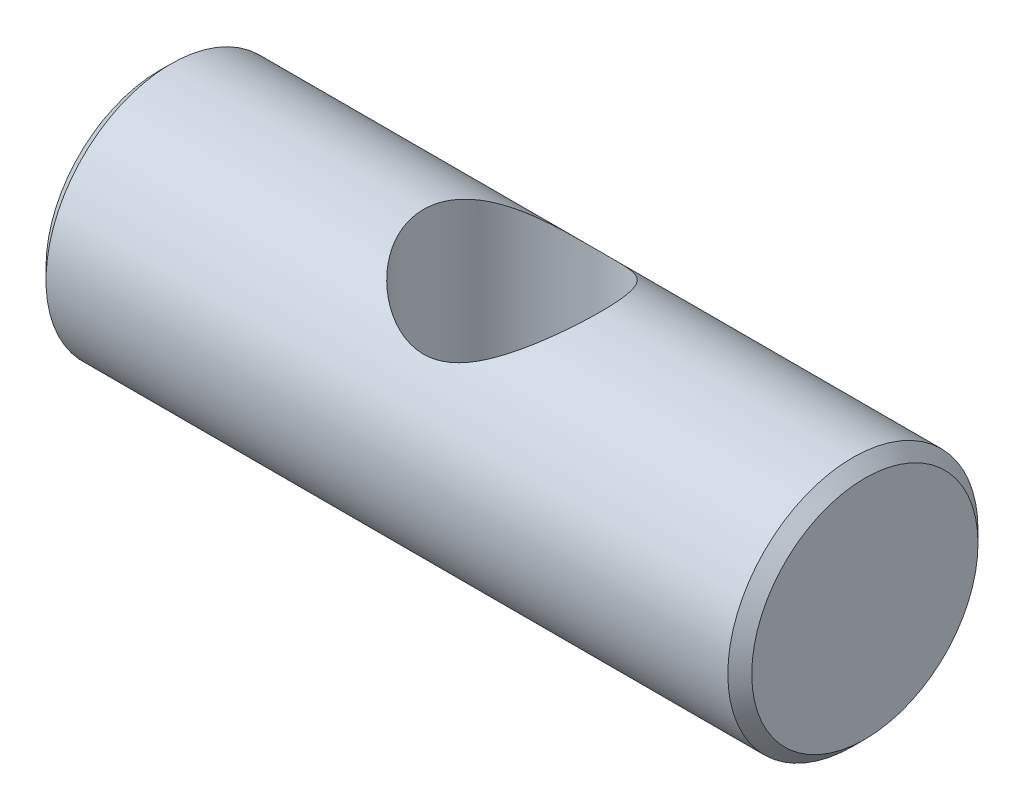
ISO-10303-21;
HEADER;
FILE_DESCRIPTION(('STEP AP214'),'2;1');
FILE_NAME('part.step','',(''),(''),'','','');
FILE_SCHEMA(('AUTOMOTIVE_DESIGN { 1 0 10303 214 1 1 1 1 }'));
ENDSEC;
DATA;
#1=APPLICATION_CONTEXT('core data for automotive mechanical design processes');
#2=APPLICATION_PROTOCOL_DEFINITION('international standard','automotive_design',2000,#1);
#3=PRODUCT_CONTEXT('',#1,'mechanical');
#4=PRODUCT('Part','Part','',(#3));
#5=PRODUCT_RELATED_PRODUCT_CATEGORY('part','',(#4));
#6=PRODUCT_DEFINITION_FORMATION('','',#4);
#7=PRODUCT_DEFINITION_CONTEXT('part definition',#1,'design');
#8=PRODUCT_DEFINITION('design','',#6,#7);
#9=PRODUCT_DEFINITION_SHAPE('','',#8);
#10=(LENGTH_UNIT() NAMED_UNIT(*) SI_UNIT(.MILLI.,.METRE.));
#11=(NAMED_UNIT(*) PLANE_ANGLE_UNIT() SI_UNIT($,.RADIAN.));
#12=(NAMED_UNIT(*) SI_UNIT($,.STERADIAN.) SOLID_ANGLE_UNIT());
#13=UNCERTAINTY_MEASURE_WITH_UNIT(LENGTH_MEASURE(1.E-05),#10,'distance_accuracy_value','');
#14=(GEOMETRIC_REPRESENTATION_CONTEXT(3) GLOBAL_UNCERTAINTY_ASSIGNED_CONTEXT((#13)) GLOBAL_UNIT_ASSIGNED_CONTEXT((#10,
#11,#12)) REPRESENTATION_CONTEXT('',''));
#15=CARTESIAN_POINT('',(0.,0.,0.));
#16=DIRECTION('',(0.,0.,1.));
#17=DIRECTION('',(1.,0.,0.));
#18=AXIS2_PLACEMENT_3D('',#15,#16,#17);
#19=CARTESIAN_POINT('',(0.,-3.2512,0.));
#20=DIRECTION('',(0.,1.,0.));
#21=DIRECTION('',(0.,0.,1.));
#22=AXIS2_PLACEMENT_3D('',#19,#20,#21);
#23=CYLINDRICAL_SURFACE('',#22,2.2479);
#24=CARTESIAN_POINT('',(0.,2.24042578607282,2.2479));
#25=CARTESIAN_POINT('',(-0.0537109222047659,2.24042480681561,2.24790052674043));
#26=CARTESIAN_POINT('',(-0.107415910724846,2.24236790219379,2.24596984430389));
#27=CARTESIAN_POINT('',(-0.21429267848827,2.25001756988373,2.23830503892118));
#28=CARTESIAN_POINT('',(-0.267464218879364,2.25572575780816,2.23256928320038));
#29=CARTESIAN_POINT('',(-0.425621878794791,2.27811595301241,2.20980208374806));
#30=CARTESIAN_POINT('',(-0.529122154814027,2.30006251636457,2.18721115424107));
#31=CARTESIAN_POINT('',(-0.728114975075887,2.35382585101758,2.12921938163096));
#32=CARTESIAN_POINT('',(-0.823686304353623,2.38552550345795,2.09396975110969));
#33=CARTESIAN_POINT('',(-1.00734597553308,2.4550023626235,2.01206707649596));
#34=CARTESIAN_POINT('',(-1.09543401923457,2.49277981136839,1.96541357825958));
#35=CARTESIAN_POINT('',(-1.27898495269226,2.57828612332488,1.85226546109516));
#36=CARTESIAN_POINT('',(-1.37291274116306,2.62658097137406,1.78370995440357));
#37=CARTESIAN_POINT('',(-1.54930843985851,2.72294307114867,1.63284401415508));
#38=CARTESIAN_POINT('',(-1.63176173401299,2.77100995860822,1.55051632629234));
#39=CARTESIAN_POINT('',(-1.79703046761159,2.87120033747202,1.35740517350871));
#40=CARTESIAN_POINT('',(-1.87745895021036,2.9225951196008,1.24416285969268));
#41=CARTESIAN_POINT('',(-2.01733938295148,3.01436410429773,1.00144708177631));
#42=CARTESIAN_POINT('',(-2.0768342764481,3.05476082938206,0.872007593447904));
#43=CARTESIAN_POINT('',(-2.15799855995829,3.11060546098944,0.637941095013784));
#44=CARTESIAN_POINT('',(-2.18556755715773,3.12985762579621,0.536251541304838));
#45=CARTESIAN_POINT('',(-2.22624802432013,3.15839710398021,0.328676755748413));
#46=CARTESIAN_POINT('',(-2.23937126186062,3.16769252799459,0.222795011832668));
#47=CARTESIAN_POINT('',(-2.25041726781011,3.17551106747307,0.00961981493627157));
#48=CARTESIAN_POINT('',(-2.24830896045661,3.17401216010376,-0.0976760780763765));
#49=CARTESIAN_POINT('',(-2.22895033394951,3.16032928964492,-0.310204852932953));
#50=CARTESIAN_POINT('',(-2.21169582012088,3.14814236655746,-0.415437155020055));
#51=CARTESIAN_POINT('',(-2.16363237049291,3.11456689332342,-0.618355387693775));
#52=CARTESIAN_POINT('',(-2.13316786385447,3.09341245158065,-0.71616336671814));
#53=CARTESIAN_POINT('',(-2.06014747187272,3.04351872913014,-0.905047335043489));
#54=CARTESIAN_POINT('',(-2.01758929552188,3.01477801136253,-0.996122044680085));
#55=CARTESIAN_POINT('',(-1.91645840280552,2.94800193382969,-1.18002386545818));
#56=CARTESIAN_POINT('',(-1.85662685545849,2.90928651565154,-1.2719075266416));
#57=CARTESIAN_POINT('',(-1.72545335615151,2.82737884446098,-1.44487716024602));
#58=CARTESIAN_POINT('',(-1.65409926674496,2.78418188809731,-1.52595158035719));
#59=CARTESIAN_POINT('',(-1.48718277532833,2.68807028145804,-1.69040534222362));
#60=CARTESIAN_POINT('',(-1.38957794640485,2.63481770717866,-1.77151939409626));
#61=CARTESIAN_POINT('',(-1.18108333038507,2.53106365150156,-1.91682959161943));
#62=CARTESIAN_POINT('',(-1.07019394403743,2.48056208718231,-1.98102624742182));
#63=CARTESIAN_POINT('',(-0.86263953317336,2.39932155828788,-2.07819063146827));
#64=CARTESIAN_POINT('',(-0.768488887790755,2.36670137202755,-2.11494098027586));
#65=CARTESIAN_POINT('',(-0.57366469286713,2.31084141504793,-2.17584470486237));
#66=CARTESIAN_POINT('',(-0.473011978674849,2.28757325388182,-2.20003627223663));
#67=CARTESIAN_POINT('',(-0.309548206638323,2.26091305743354,-2.22733632967836));
#68=CARTESIAN_POINT('',(-0.248160259876556,2.25328286367124,-2.2350227892514));
#69=CARTESIAN_POINT('',(-0.124512264812123,2.24303959423893,-2.24530452337338));
#70=CARTESIAN_POINT('',(-0.0622521469509865,2.24042692105359,-2.2478993894962));
#71=CARTESIAN_POINT('',(0.0537109222047628,2.24042480681561,-2.24790052674043));
#72=CARTESIAN_POINT('',(0.107415910724843,2.24236790219379,-2.24596984430389));
#73=CARTESIAN_POINT('',(0.214292678488267,2.25001756988373,-2.23830503892118));
#74=CARTESIAN_POINT('',(0.267464218879361,2.25572575780816,-2.23256928320039));
#75=CARTESIAN_POINT('',(0.425621878794788,2.27811595301241,-2.20980208374806));
#76=CARTESIAN_POINT('',(0.529122154814024,2.30006251636457,-2.18721115424107));
#77=CARTESIAN_POINT('',(0.728114975075883,2.35382585101758,-2.12921938163096));
#78=CARTESIAN_POINT('',(0.823686304353619,2.38552550345795,-2.09396975110969));
#79=CARTESIAN_POINT('',(1.00734597553308,2.4550023626235,-2.01206707649596));
#80=CARTESIAN_POINT('',(1.09543401923457,2.49277981136838,-1.96541357825958));
#81=CARTESIAN_POINT('',(1.27898495269226,2.57828612332488,-1.85226546109516));
#82=CARTESIAN_POINT('',(1.37291274116306,2.62658097137406,-1.78370995440357));
#83=CARTESIAN_POINT('',(1.54930843985851,2.72294307114867,-1.63284401415508));
#84=CARTESIAN_POINT('',(1.63176173401299,2.77100995860821,-1.55051632629235));
#85=CARTESIAN_POINT('',(1.79703046761159,2.87120033747202,-1.35740517350871));
#86=CARTESIAN_POINT('',(1.87745895021036,2.92259511960079,-1.24416285969268));
#87=CARTESIAN_POINT('',(2.01733938295148,3.01436410429773,-1.00144708177632));
#88=CARTESIAN_POINT('',(2.0768342764481,3.05476082938206,-0.872007593447909));
#89=CARTESIAN_POINT('',(2.15799855995829,3.11060546098944,-0.637941095013788));
#90=CARTESIAN_POINT('',(2.18556755715773,3.1298576257962,-0.536251541304843));
#91=CARTESIAN_POINT('',(2.22624802432013,3.15839710398021,-0.328676755748417));
#92=CARTESIAN_POINT('',(2.23937126186062,3.16769252799459,-0.222795011832672));
#93=CARTESIAN_POINT('',(2.25041726781011,3.17551106747307,-0.00961981493627542));
#94=CARTESIAN_POINT('',(2.24830896045661,3.17401216010376,0.0976760780763729));
#95=CARTESIAN_POINT('',(2.22895033394951,3.16032928964492,0.31020485293295));
#96=CARTESIAN_POINT('',(2.21169582012088,3.14814236655746,0.415437155020052));
#97=CARTESIAN_POINT('',(2.16363237049291,3.11456689332342,0.618355387693773));
#98=CARTESIAN_POINT('',(2.13316786385447,3.09341245158065,0.716163366718138));
#99=CARTESIAN_POINT('',(2.06014747187272,3.04351872913014,0.905047335043487));
#100=CARTESIAN_POINT('',(2.01758929552188,3.01477801136253,0.996122044680082));
#101=CARTESIAN_POINT('',(1.91645840280552,2.9480019338297,1.18002386545818));
#102=CARTESIAN_POINT('',(1.85662685545849,2.90928651565155,1.27190752664159));
#103=CARTESIAN_POINT('',(1.72545335615151,2.82737884446098,1.44487716024601));
#104=CARTESIAN_POINT('',(1.65409926674496,2.78418188809731,1.52595158035719));
#105=CARTESIAN_POINT('',(1.48718277532834,2.68807028145804,1.69040534222362));
#106=CARTESIAN_POINT('',(1.38957794640485,2.63481770717866,1.77151939409625));
#107=CARTESIAN_POINT('',(1.18108333038508,2.53106365150156,1.91682959161943));
#108=CARTESIAN_POINT('',(1.07019394403743,2.48056208718231,1.98102624742182));
#109=CARTESIAN_POINT('',(0.862639533173363,2.39932155828788,2.07819063146827));
#110=CARTESIAN_POINT('',(0.768488887790758,2.36670137202755,2.11494098027586));
#111=CARTESIAN_POINT('',(0.573664692867132,2.31084141504793,2.17584470486237));
#112=CARTESIAN_POINT('',(0.473011978674852,2.28757325388182,2.20003627223663));
#113=CARTESIAN_POINT('',(0.309548206638325,2.26091305743354,2.22733632967836));
#114=CARTESIAN_POINT('',(0.248160259876557,2.25328286367124,2.2350227892514));
#115=CARTESIAN_POINT('',(0.124512264812122,2.24303959423893,2.24530452337338));
#116=CARTESIAN_POINT('',(0.0622521469509844,2.24042692105359,2.2478993894962));
#117=CARTESIAN_POINT('',(0.,2.24042578607282,2.2479));
#118=B_SPLINE_CURVE_WITH_KNOTS('',3,(#24,#25,#26,#27,#28,#29,#30,#31,#32,#33,#34,#35,#36,#37,
#38,#39,#40,#41,#42,#43,#44,#45,#46,#47,#48,#49,#50,#51,#52,#53,#54,#55,#56,#57,#58,#59,#60,#61,
#62,#63,#64,#65,#66,#67,#68,#69,#70,#71,#72,#73,#74,#75,#76,#77,#78,#79,#80,#81,#82,#83,#84,#85,
#86,#87,#88,#89,#90,#91,#92,#93,#94,#95,#96,#97,#98,#99,#100,#101,#102,#103,#104,#105,#106,#107,
#108,#109,#110,#111,#112,#113,#114,#115,#116,#117),.UNSPECIFIED.,.T.,.F.,(4,2,2,2,2,2,2,2,2,2,2,
2,2,2,2,2,2,2,2,2,2,2,2,2,2,2,2,2,2,2,2,2,2,2,2,2,2,2,2,2,2,2,2,2,2,2,4),(0.,0.161049247055113,
0.322167645829137,0.64478438526156,0.963668987437373,1.28256629083955,1.65897662189148,
2.03586211505108,2.47770566111403,2.91863744704056,3.23857938672654,3.55826050702774,
3.87859403232042,4.19901630056844,4.5115439763463,4.82413089643475,5.17168188843986,
5.51960139576506,5.93083300076942,6.34205220347626,6.65959200600966,6.97616041975302,
7.16280508835439,7.34946472819077,7.51051397524588,7.67163237401991,7.99424911345233,
8.31313371562814,8.63203101903032,9.00844135008225,9.38532684324185,9.8271703893048,
10.2681021752313,10.5880441149173,10.9077252352185,11.2280587605112,11.5484810287592,
11.8610087045371,12.1735956246255,12.5211466166306,12.8690661239558,13.2802977289602,
13.691516931667,14.0090567342004,14.3256251479438,14.5122698165452,14.6989294563816),.UNSPECIFIED.);
#119=CARTESIAN_POINT('',(0.,2.24042578607282,2.2479));
#120=VERTEX_POINT('',#119);
#121=EDGE_CURVE('E28',#120,#120,#118,.T.);
#122=ORIENTED_EDGE('',*,*,#121,.F.);
#123=EDGE_LOOP('',(#122));
#124=FACE_BOUND('',#123,.T.);
#125=CARTESIAN_POINT('',(0.,-2.24042578607282,-2.2479));
#126=CARTESIAN_POINT('',(-0.0537109222047621,-2.24042480681561,-2.24790052674043));
#127=CARTESIAN_POINT('',(-0.107415910724842,-2.24236790219379,-2.24596984430389));
#128=CARTESIAN_POINT('',(-0.214292678488266,-2.25001756988373,-2.23830503892118));
#129=CARTESIAN_POINT('',(-0.26746421887936,-2.25572575780816,-2.23256928320039));
#130=CARTESIAN_POINT('',(-0.425621878794787,-2.27811595301241,-2.20980208374806));
#131=CARTESIAN_POINT('',(-0.529122154814023,-2.30006251636457,-2.18721115424107));
#132=CARTESIAN_POINT('',(-0.728114975075883,-2.35382585101758,-2.12921938163096));
#133=CARTESIAN_POINT('',(-0.823686304353619,-2.38552550345795,-2.09396975110969));
#134=CARTESIAN_POINT('',(-1.00734597553308,-2.4550023626235,-2.01206707649597));
#135=CARTESIAN_POINT('',(-1.09543401923457,-2.49277981136838,-1.96541357825958));
#136=CARTESIAN_POINT('',(-1.27898495269226,-2.57828612332488,-1.85226546109516));
#137=CARTESIAN_POINT('',(-1.37291274116306,-2.62658097137406,-1.78370995440357));
#138=CARTESIAN_POINT('',(-1.54930843985851,-2.72294307114867,-1.63284401415508));
#139=CARTESIAN_POINT('',(-1.63176173401298,-2.77100995860821,-1.55051632629235));
#140=CARTESIAN_POINT('',(-1.79703046761159,-2.87120033747202,-1.35740517350872));
#141=CARTESIAN_POINT('',(-1.87745895021036,-2.92259511960079,-1.24416285969269));
#142=CARTESIAN_POINT('',(-2.01733938295148,-3.01436410429773,-1.00144708177632));
#143=CARTESIAN_POINT('',(-2.0768342764481,-3.05476082938206,-0.87200759344791));
#144=CARTESIAN_POINT('',(-2.15799855995829,-3.11060546098944,-0.637941095013789));
#145=CARTESIAN_POINT('',(-2.18556755715773,-3.1298576257962,-0.536251541304844));
#146=CARTESIAN_POINT('',(-2.22624802432013,-3.15839710398021,-0.328676755748418));
#147=CARTESIAN_POINT('',(-2.23937126186062,-3.16769252799459,-0.222795011832673));
#148=CARTESIAN_POINT('',(-2.25041726781011,-3.17551106747307,-0.00961981493627659));
#149=CARTESIAN_POINT('',(-2.24830896045661,-3.17401216010376,0.0976760780763717));
#150=CARTESIAN_POINT('',(-2.22895033394951,-3.16032928964492,0.310204852932949));
#151=CARTESIAN_POINT('',(-2.21169582012088,-3.14814236655746,0.41543715502005));
#152=CARTESIAN_POINT('',(-2.16363237049291,-3.11456689332342,0.618355387693771));
#153=CARTESIAN_POINT('',(-2.13316786385447,-3.09341245158066,0.716163366718136));
#154=CARTESIAN_POINT('',(-2.06014747187272,-3.04351872913014,0.905047335043485));
#155=CARTESIAN_POINT('',(-2.01758929552188,-3.01477801136254,0.996122044680081));
#156=CARTESIAN_POINT('',(-1.91645840280552,-2.9480019338297,1.18002386545818));
#157=CARTESIAN_POINT('',(-1.85662685545849,-2.90928651565155,1.27190752664159));
#158=CARTESIAN_POINT('',(-1.72545335615152,-2.82737884446099,1.44487716024601));
#159=CARTESIAN_POINT('',(-1.65409926674496,-2.78418188809731,1.52595158035719));
#160=CARTESIAN_POINT('',(-1.48718277532834,-2.68807028145804,1.69040534222361));
#161=CARTESIAN_POINT('',(-1.38957794640485,-2.63481770717866,1.77151939409625));
#162=CARTESIAN_POINT('',(-1.18108333038508,-2.53106365150156,1.91682959161943));
#163=CARTESIAN_POINT('',(-1.07019394403743,-2.48056208718231,1.98102624742182));
#164=CARTESIAN_POINT('',(-0.862639533173365,-2.39932155828788,2.07819063146827));
#165=CARTESIAN_POINT('',(-0.76848888779076,-2.36670137202755,2.11494098027585));
#166=CARTESIAN_POINT('',(-0.573664692867134,-2.31084141504793,2.17584470486237));
#167=CARTESIAN_POINT('',(-0.473011978674854,-2.28757325388182,2.20003627223663));
#168=CARTESIAN_POINT('',(-0.309548206638326,-2.26091305743354,2.22733632967836));
#169=CARTESIAN_POINT('',(-0.248160259876558,-2.25328286367124,2.2350227892514));
#170=CARTESIAN_POINT('',(-0.124512264812122,-2.24303959423893,2.24530452337338));
#171=CARTESIAN_POINT('',(-0.0622521469509845,-2.24042692105359,2.2478993894962));
#172=CARTESIAN_POINT('',(0.0537109222047657,-2.24042480681561,2.24790052674043));
#173=CARTESIAN_POINT('',(0.107415910724845,-2.24236790219379,2.24596984430389));
#174=CARTESIAN_POINT('',(0.21429267848827,-2.25001756988373,2.23830503892118));
#175=CARTESIAN_POINT('',(0.267464218879363,-2.25572575780816,2.23256928320039));
#176=CARTESIAN_POINT('',(0.425621878794791,-2.27811595301241,2.20980208374806));
#177=CARTESIAN_POINT('',(0.529122154814027,-2.30006251636457,2.18721115424107));
#178=CARTESIAN_POINT('',(0.728114975075886,-2.35382585101758,2.12921938163096));
#179=CARTESIAN_POINT('',(0.823686304353622,-2.38552550345795,2.09396975110969));
#180=CARTESIAN_POINT('',(1.00734597553308,-2.4550023626235,2.01206707649596));
#181=CARTESIAN_POINT('',(1.09543401923457,-2.49277981136839,1.96541357825958));
#182=CARTESIAN_POINT('',(1.27898495269226,-2.57828612332488,1.85226546109516));
#183=CARTESIAN_POINT('',(1.37291274116306,-2.62658097137406,1.78370995440357));
#184=CARTESIAN_POINT('',(1.54930843985851,-2.72294307114867,1.63284401415508));
#185=CARTESIAN_POINT('',(1.63176173401299,-2.77100995860822,1.55051632629234));
#186=CARTESIAN_POINT('',(1.79703046761159,-2.87120033747202,1.35740517350871));
#187=CARTESIAN_POINT('',(1.87745895021036,-2.9225951196008,1.24416285969268));
#188=CARTESIAN_POINT('',(2.01733938295148,-3.01436410429773,1.00144708177631));
#189=CARTESIAN_POINT('',(2.0768342764481,-3.05476082938206,0.872007593447904));
#190=CARTESIAN_POINT('',(2.15799855995829,-3.11060546098944,0.637941095013784));
#191=CARTESIAN_POINT('',(2.18556755715773,-3.12985762579621,0.536251541304839));
#192=CARTESIAN_POINT('',(2.22624802432013,-3.15839710398021,0.328676755748413));
#193=CARTESIAN_POINT('',(2.23937126186062,-3.16769252799459,0.222795011832668));
#194=CARTESIAN_POINT('',(2.25041726781011,-3.17551106747307,0.0096198149362719));
#195=CARTESIAN_POINT('',(2.24830896045661,-3.17401216010376,-0.0976760780763758));
#196=CARTESIAN_POINT('',(2.22895033394951,-3.16032928964492,-0.310204852932952));
#197=CARTESIAN_POINT('',(2.21169582012088,-3.14814236655746,-0.415437155020054));
#198=CARTESIAN_POINT('',(2.16363237049291,-3.11456689332342,-0.618355387693775));
#199=CARTESIAN_POINT('',(2.13316786385447,-3.09341245158065,-0.71616336671814));
#200=CARTESIAN_POINT('',(2.06014747187272,-3.04351872913014,-0.905047335043489));
#201=CARTESIAN_POINT('',(2.01758929552188,-3.01477801136253,-0.996122044680085));
#202=CARTESIAN_POINT('',(1.91645840280552,-2.94800193382969,-1.18002386545818));
#203=CARTESIAN_POINT('',(1.85662685545849,-2.90928651565154,-1.2719075266416));
#204=CARTESIAN_POINT('',(1.72545335615151,-2.82737884446098,-1.44487716024602));
#205=CARTESIAN_POINT('',(1.65409926674496,-2.78418188809731,-1.52595158035719));
#206=CARTESIAN_POINT('',(1.48718277532833,-2.68807028145804,-1.69040534222362));
#207=CARTESIAN_POINT('',(1.38957794640485,-2.63481770717866,-1.77151939409626));
#208=CARTESIAN_POINT('',(1.18108333038507,-2.53106365150156,-1.91682959161943));
#209=CARTESIAN_POINT('',(1.07019394403743,-2.48056208718231,-1.98102624742182));
#210=CARTESIAN_POINT('',(0.86263953317336,-2.39932155828788,-2.07819063146827));
#211=CARTESIAN_POINT('',(0.768488887790755,-2.36670137202755,-2.11494098027586));
#212=CARTESIAN_POINT('',(0.573664692867129,-2.31084141504793,-2.17584470486237));
#213=CARTESIAN_POINT('',(0.473011978674849,-2.28757325388182,-2.20003627223663));
#214=CARTESIAN_POINT('',(0.309548206638323,-2.26091305743354,-2.22733632967836));
#215=CARTESIAN_POINT('',(0.248160259876557,-2.25328286367124,-2.2350227892514));
#216=CARTESIAN_POINT('',(0.124512264812124,-2.24303959423893,-2.24530452337338));
#217=CARTESIAN_POINT('',(0.0622521469509871,-2.24042692105359,-2.2478993894962));
#218=CARTESIAN_POINT('',(0.,-2.24042578607282,-2.2479));
#219=B_SPLINE_CURVE_WITH_KNOTS('',3,(#125,#126,#127,#128,#129,#130,#131,#132,#133,#134,#135,
#136,#137,#138,#139,#140,#141,#142,#143,#144,#145,#146,#147,#148,#149,#150,#151,#152,#153,#154,
#155,#156,#157,#158,#159,#160,#161,#162,#163,#164,#165,#166,#167,#168,#169,#170,#171,#172,#173,
#174,#175,#176,#177,#178,#179,#180,#181,#182,#183,#184,#185,#186,#187,#188,#189,#190,#191,#192,
#193,#194,#195,#196,#197,#198,#199,#200,#201,#202,#203,#204,#205,#206,#207,#208,#209,#210,#211,
#212,#213,#214,#215,#216,#217,#218),.UNSPECIFIED.,.T.,.F.,(4,2,2,2,2,2,2,2,2,2,2,2,2,2,2,2,2,2,
2,2,2,2,2,2,2,2,2,2,2,2,2,2,2,2,2,2,2,2,2,2,2,2,2,2,2,2,4),(0.,0.161049247055113,
0.322167645829136,0.64478438526156,0.963668987437373,1.28256629083955,1.65897662189148,
2.03586211505108,2.47770566111402,2.91863744704056,3.23857938672654,3.55826050702774,
3.87859403232041,4.19901630056844,4.5115439763463,4.82413089643475,5.17168188843986,
5.51960139576505,5.93083300076941,6.34205220347626,6.65959200600965,6.97616041975301,
7.1628050883544,7.34946472819078,7.51051397524589,7.67163237401991,7.99424911345234,
8.31313371562815,8.63203101903033,9.00844135008226,9.38532684324186,9.82717038930481,
10.2681021752313,10.5880441149173,10.9077252352185,11.2280587605112,11.5484810287592,
11.8610087045371,12.1735956246255,12.5211466166306,12.8690661239558,13.2802977289602,
13.691516931667,14.0090567342004,14.3256251479438,14.5122698165452,14.6989294563816),.UNSPECIFIED.);
#220=CARTESIAN_POINT('',(0.,-2.24042578607282,-2.2479));
#221=VERTEX_POINT('',#220);
#222=EDGE_CURVE('E19',#221,#221,#219,.T.);
#223=ORIENTED_EDGE('',*,*,#222,.F.);
#224=EDGE_LOOP('',(#223));
#225=FACE_BOUND('',#224,.T.);
#226=ADVANCED_FACE('F15',(#124,#225),#23,.F.);
#227=CARTESIAN_POINT('',(8.9535,0.,0.));
#228=DIRECTION('',(-1.,0.,0.));
#229=DIRECTION('',(0.,0.,1.));
#230=AXIS2_PLACEMENT_3D('',#227,#228,#229);
#231=CONICAL_SURFACE('',#230,2.8702,0.785398163397446);
#232=CARTESIAN_POINT('',(8.64997,0.,0.));
#233=DIRECTION('',(1.,0.,0.));
#234=DIRECTION('',(0.,0.,1.));
#235=AXIS2_PLACEMENT_3D('',#232,#233,#234);
#236=CIRCLE('',#235,3.17373);
#237=CARTESIAN_POINT('',(8.64997,0.,3.17373));
#238=VERTEX_POINT('',#237);
#239=EDGE_CURVE('E10',#238,#238,#236,.T.);
#240=ORIENTED_EDGE('',*,*,#239,.T.);
#241=EDGE_LOOP('',(#240));
#242=FACE_BOUND('',#241,.T.);
#243=CARTESIAN_POINT('',(8.9535,0.,0.));
#244=DIRECTION('',(1.,0.,0.));
#245=DIRECTION('',(0.,0.,-1.));
#246=AXIS2_PLACEMENT_3D('',#243,#244,#245);
#247=CIRCLE('',#246,2.8702);
#248=CARTESIAN_POINT('',(8.9535,0.,-2.8702));
#249=VERTEX_POINT('',#248);
#250=EDGE_CURVE('E36',#249,#249,#247,.T.);
#251=ORIENTED_EDGE('',*,*,#250,.F.);
#252=EDGE_LOOP('',(#251));
#253=FACE_BOUND('',#252,.T.);
#254=ADVANCED_FACE('F51',(#242,#253),#231,.T.);
#255=CARTESIAN_POINT('',(-8.9535,0.,0.));
#256=DIRECTION('',(1.,0.,0.));
#257=DIRECTION('',(0.,0.,-1.));
#258=AXIS2_PLACEMENT_3D('',#255,#256,#257);
#259=CYLINDRICAL_SURFACE('',#258,3.17373);
#260=ORIENTED_EDGE('',*,*,#239,.F.);
#261=EDGE_LOOP('',(#260));
#262=FACE_BOUND('',#261,.T.);
#263=ORIENTED_EDGE('',*,*,#121,.T.);
#264=EDGE_LOOP('',(#263));
#265=FACE_BOUND('',#264,.T.);
#266=CARTESIAN_POINT('',(-8.64997,0.,0.));
#267=DIRECTION('',(-1.,0.,0.));
#268=DIRECTION('',(0.,0.,-1.));
#269=AXIS2_PLACEMENT_3D('',#266,#267,#268);
#270=CIRCLE('',#269,3.17373);
#271=CARTESIAN_POINT('',(-8.64997,0.,-3.17373));
#272=VERTEX_POINT('',#271);
#273=EDGE_CURVE('E33',#272,#272,#270,.T.);
#274=ORIENTED_EDGE('',*,*,#273,.F.);
#275=EDGE_LOOP('',(#274));
#276=FACE_BOUND('',#275,.T.);
#277=ORIENTED_EDGE('',*,*,#222,.T.);
#278=EDGE_LOOP('',(#277));
#279=FACE_BOUND('',#278,.T.);
#280=ADVANCED_FACE('F46',(#262,#265,#276,#279),#259,.T.);
#281=CARTESIAN_POINT('',(-8.5725,0.,0.));
#282=DIRECTION('',(1.,0.,0.));
#283=DIRECTION('',(0.,0.,-1.));
#284=AXIS2_PLACEMENT_3D('',#281,#282,#283);
#285=CONICAL_SURFACE('',#284,3.2512,0.785398163397452);
#286=ORIENTED_EDGE('',*,*,#273,.T.);
#287=EDGE_LOOP('',(#286));
#288=FACE_BOUND('',#287,.T.);
#289=CARTESIAN_POINT('',(-8.9535,0.,0.));
#290=DIRECTION('',(-1.,0.,0.));
#291=DIRECTION('',(0.,0.,-1.));
#292=AXIS2_PLACEMENT_3D('',#289,#290,#291);
#293=CIRCLE('',#292,2.8702);
#294=CARTESIAN_POINT('',(-8.9535,0.,-2.8702));
#295=VERTEX_POINT('',#294);
#296=EDGE_CURVE('E39',#295,#295,#293,.T.);
#297=ORIENTED_EDGE('',*,*,#296,.F.);
#298=EDGE_LOOP('',(#297));
#299=FACE_BOUND('',#298,.T.);
#300=ADVANCED_FACE('F50',(#288,#299),#285,.T.);
#301=CARTESIAN_POINT('',(-8.9535,0.,0.));
#302=DIRECTION('',(1.,0.,0.));
#303=DIRECTION('',(0.,0.,-1.));
#304=AXIS2_PLACEMENT_3D('',#301,#302,#303);
#305=PLANE('',#304);
#306=ORIENTED_EDGE('',*,*,#296,.T.);
#307=EDGE_LOOP('',(#306));
#308=FACE_BOUND('',#307,.T.);
#309=ADVANCED_FACE('F55',(#308),#305,.F.);
#310=CARTESIAN_POINT('',(8.9535,0.,0.));
#311=DIRECTION('',(1.,0.,0.));
#312=DIRECTION('',(0.,0.,-1.));
#313=AXIS2_PLACEMENT_3D('',#310,#311,#312);
#314=PLANE('',#313);
#315=ORIENTED_EDGE('',*,*,#250,.T.);
#316=EDGE_LOOP('',(#315));
#317=FACE_BOUND('',#316,.T.);
#318=ADVANCED_FACE('F17',(#317),#314,.T.);
#319=CLOSED_SHELL('',(#226,#254,#280,#300,#309,#318));
#320=MANIFOLD_SOLID_BREP('B1',#319);
#321=ADVANCED_BREP_SHAPE_REPRESENTATION('',(#18,#320),#14);
#322=SHAPE_DEFINITION_REPRESENTATION(#9,#321);
ENDSEC;
END-ISO-10303-21;
